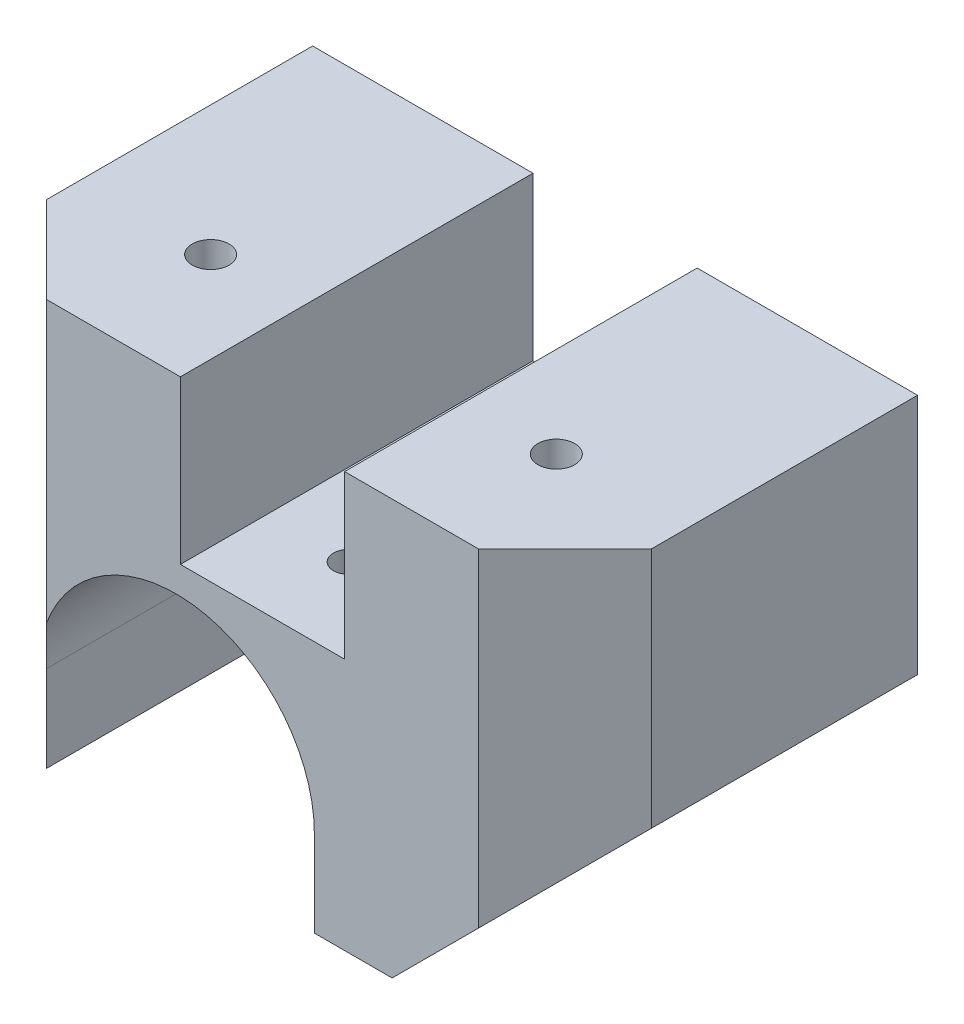
ISO-10303-21;
HEADER;
FILE_DESCRIPTION(('STEP AP214'),'2;1');
FILE_NAME('part.step','',(''),(''),'','','');
FILE_SCHEMA(('AUTOMOTIVE_DESIGN { 1 0 10303 214 1 1 1 1 }'));
ENDSEC;
DATA;
#1=APPLICATION_CONTEXT('core data for automotive mechanical design processes');
#2=APPLICATION_PROTOCOL_DEFINITION('international standard','automotive_design',2000,#1);
#3=PRODUCT_CONTEXT('',#1,'mechanical');
#4=PRODUCT('Part','Part','',(#3));
#5=PRODUCT_RELATED_PRODUCT_CATEGORY('part','',(#4));
#6=PRODUCT_DEFINITION_FORMATION('','',#4);
#7=PRODUCT_DEFINITION_CONTEXT('part definition',#1,'design');
#8=PRODUCT_DEFINITION('design','',#6,#7);
#9=PRODUCT_DEFINITION_SHAPE('','',#8);
#10=(LENGTH_UNIT() NAMED_UNIT(*) SI_UNIT(.MILLI.,.METRE.));
#11=(NAMED_UNIT(*) PLANE_ANGLE_UNIT() SI_UNIT($,.RADIAN.));
#12=(NAMED_UNIT(*) SI_UNIT($,.STERADIAN.) SOLID_ANGLE_UNIT());
#13=UNCERTAINTY_MEASURE_WITH_UNIT(LENGTH_MEASURE(1.E-05),#10,'distance_accuracy_value','');
#14=(GEOMETRIC_REPRESENTATION_CONTEXT(3) GLOBAL_UNCERTAINTY_ASSIGNED_CONTEXT((#13)) GLOBAL_UNIT_ASSIGNED_CONTEXT((#10,
#11,#12)) REPRESENTATION_CONTEXT('',''));
#15=CARTESIAN_POINT('',(0.,0.,0.));
#16=DIRECTION('',(0.,0.,1.));
#17=DIRECTION('',(1.,0.,0.));
#18=AXIS2_PLACEMENT_3D('',#15,#16,#17);
#19=CARTESIAN_POINT('',(0.,0.,0.));
#20=DIRECTION('',(0.,-1.,0.));
#21=DIRECTION('',(0.,0.,-1.));
#22=AXIS2_PLACEMENT_3D('',#19,#20,#21);
#23=PLANE('',#22);
#24=DIRECTION('',(0.,0.,-1.));
#25=VECTOR('',#24,1.);
#26=CARTESIAN_POINT('',(-16.51,0.,12.954));
#27=LINE('',#26,#25);
#28=CARTESIAN_POINT('',(-16.51,0.,12.319));
#29=VERTEX_POINT('',#28);
#30=CARTESIAN_POINT('',(-16.51,0.,-12.954));
#31=VERTEX_POINT('',#30);
#32=EDGE_CURVE('E196',#29,#31,#27,.T.);
#33=ORIENTED_EDGE('',*,*,#32,.F.);
#34=DIRECTION('',(0.707106781186547,0.,0.707106781186549));
#35=VECTOR('',#34,1.);
#36=CARTESIAN_POINT('',(-14.4145,0.,14.4145));
#37=LINE('',#36,#35);
#38=CARTESIAN_POINT('',(-22.225,0.,6.60399999999998));
#39=VERTEX_POINT('',#38);
#40=EDGE_CURVE('E281',#29,#39,#37,.F.);
#41=ORIENTED_EDGE('',*,*,#40,.T.);
#42=DIRECTION('',(0.,0.,1.));
#43=VECTOR('',#42,1.);
#44=CARTESIAN_POINT('',(-22.225,0.,12.954));
#45=LINE('',#44,#43);
#46=CARTESIAN_POINT('',(-22.225,0.,-12.954));
#47=VERTEX_POINT('',#46);
#48=EDGE_CURVE('E256',#47,#39,#45,.T.);
#49=ORIENTED_EDGE('',*,*,#48,.F.);
#50=DIRECTION('',(-1.,0.,0.));
#51=VECTOR('',#50,1.);
#52=CARTESIAN_POINT('',(-22.225,0.,-12.954));
#53=LINE('',#52,#51);
#54=EDGE_CURVE('E231',#31,#47,#53,.T.);
#55=ORIENTED_EDGE('',*,*,#54,.F.);
#56=EDGE_LOOP('',(#33,#41,#49,#55));
#57=FACE_BOUND('',#56,.T.);
#58=ADVANCED_FACE('F37',(#57),#23,.T.);
#59=CARTESIAN_POINT('',(0.,30.48,0.));
#60=DIRECTION('',(0.,-1.,0.));
#61=DIRECTION('',(0.,0.,-1.));
#62=AXIS2_PLACEMENT_3D('',#59,#60,#61);
#63=PLANE('',#62);
#64=CARTESIAN_POINT('',(12.7,30.48,4.064));
#65=DIRECTION('',(0.,1.,0.));
#66=DIRECTION('',(0.,0.,1.));
#67=AXIS2_PLACEMENT_3D('',#64,#65,#66);
#68=CIRCLE('',#67,1.35254999999999);
#69=CARTESIAN_POINT('',(12.7,30.48,5.41654999999999));
#70=VERTEX_POINT('',#69);
#71=EDGE_CURVE('E195',#70,#70,#68,.T.);
#72=ORIENTED_EDGE('',*,*,#71,.F.);
#73=EDGE_LOOP('',(#72));
#74=FACE_BOUND('',#73,.T.);
#75=DIRECTION('',(-1.,0.,0.));
#76=VECTOR('',#75,1.);
#77=CARTESIAN_POINT('',(-22.225,30.48,-12.954));
#78=LINE('',#77,#76);
#79=CARTESIAN_POINT('',(22.225,30.48,-12.954));
#80=VERTEX_POINT('',#79);
#81=CARTESIAN_POINT('',(6.0325,30.48,-12.954));
#82=VERTEX_POINT('',#81);
#83=EDGE_CURVE('E242',#80,#82,#78,.T.);
#84=ORIENTED_EDGE('',*,*,#83,.T.);
#85=DIRECTION('',(0.,0.,1.));
#86=VECTOR('',#85,1.);
#87=CARTESIAN_POINT('',(6.0325,30.48,-12.954));
#88=LINE('',#87,#86);
#89=CARTESIAN_POINT('',(6.0325,30.48,12.954));
#90=VERTEX_POINT('',#89);
#91=EDGE_CURVE('E222',#82,#90,#88,.T.);
#92=ORIENTED_EDGE('',*,*,#91,.T.);
#93=DIRECTION('',(1.,0.,0.));
#94=VECTOR('',#93,1.);
#95=CARTESIAN_POINT('',(-22.225,30.48,12.954));
#96=LINE('',#95,#94);
#97=CARTESIAN_POINT('',(15.875,30.48,12.954));
#98=VERTEX_POINT('',#97);
#99=EDGE_CURVE('E248',#90,#98,#96,.T.);
#100=ORIENTED_EDGE('',*,*,#99,.T.);
#101=DIRECTION('',(-0.70710678118655,0.,0.707106781186545));
#102=VECTOR('',#101,1.);
#103=CARTESIAN_POINT('',(22.225,30.48,6.60400000000001));
#104=LINE('',#103,#102);
#105=CARTESIAN_POINT('',(22.225,30.48,6.60400000000001));
#106=VERTEX_POINT('',#105);
#107=EDGE_CURVE('E285',#98,#106,#104,.F.);
#108=ORIENTED_EDGE('',*,*,#107,.T.);
#109=DIRECTION('',(0.,0.,-1.));
#110=VECTOR('',#109,1.);
#111=CARTESIAN_POINT('',(22.225,30.48,12.954));
#112=LINE('',#111,#110);
#113=EDGE_CURVE('E238',#106,#80,#112,.T.);
#114=ORIENTED_EDGE('',*,*,#113,.T.);
#115=EDGE_LOOP('',(#84,#92,#100,#108,#114));
#116=FACE_BOUND('',#115,.T.);
#117=ADVANCED_FACE('F337',(#74,#116),#63,.F.);
#118=CARTESIAN_POINT('',(22.225,30.48,12.954));
#119=DIRECTION('',(-1.,0.,0.));
#120=DIRECTION('',(0.,0.,1.));
#121=AXIS2_PLACEMENT_3D('',#118,#119,#120);
#122=PLANE('',#121);
#123=ORIENTED_EDGE('',*,*,#113,.F.);
#124=DIRECTION('',(0.,-1.,0.));
#125=VECTOR('',#124,1.);
#126=CARTESIAN_POINT('',(22.225,30.48,6.60400000000001));
#127=LINE('',#126,#125);
#128=CARTESIAN_POINT('',(22.225,12.7,6.60400000000001));
#129=VERTEX_POINT('',#128);
#130=EDGE_CURVE('E289',#106,#129,#127,.T.);
#131=ORIENTED_EDGE('',*,*,#130,.T.);
#132=DIRECTION('',(0.,0.,-1.));
#133=VECTOR('',#132,1.);
#134=CARTESIAN_POINT('',(22.225,12.7,-12.954));
#135=LINE('',#134,#133);
#136=CARTESIAN_POINT('',(22.225,12.7,-12.954));
#137=VERTEX_POINT('',#136);
#138=EDGE_CURVE('E265',#129,#137,#135,.T.);
#139=ORIENTED_EDGE('',*,*,#138,.T.);
#140=DIRECTION('',(0.,-1.,0.));
#141=VECTOR('',#140,1.);
#142=CARTESIAN_POINT('',(22.225,30.48,-12.954));
#143=LINE('',#142,#141);
#144=EDGE_CURVE('E262',#80,#137,#143,.T.);
#145=ORIENTED_EDGE('',*,*,#144,.F.);
#146=EDGE_LOOP('',(#123,#131,#139,#145));
#147=FACE_BOUND('',#146,.T.);
#148=ADVANCED_FACE('F343',(#147),#122,.F.);
#149=CARTESIAN_POINT('',(-22.225,30.48,-12.954));
#150=DIRECTION('',(0.,0.,1.));
#151=DIRECTION('',(1.,0.,0.));
#152=AXIS2_PLACEMENT_3D('',#149,#150,#151);
#153=PLANE('',#152);
#154=CARTESIAN_POINT('',(-18.8468,6.35,-12.954));
#155=DIRECTION('',(0.,0.,-1.));
#156=DIRECTION('',(-1.,0.,0.));
#157=AXIS2_PLACEMENT_3D('',#154,#155,#156);
#158=CIRCLE('',#157,1.13029999999999);
#159=CARTESIAN_POINT('',(-19.9771,6.35,-12.954));
#160=VERTEX_POINT('',#159);
#161=EDGE_CURVE('E169',#160,#160,#158,.T.);
#162=ORIENTED_EDGE('',*,*,#161,.F.);
#163=EDGE_LOOP('',(#162));
#164=FACE_BOUND('',#163,.T.);
#165=CARTESIAN_POINT('',(6.1468,6.35,-12.954));
#166=DIRECTION('',(0.,0.,-1.));
#167=DIRECTION('',(-1.,0.,0.));
#168=AXIS2_PLACEMENT_3D('',#165,#166,#167);
#169=CIRCLE('',#168,1.13029999999999);
#170=CARTESIAN_POINT('',(5.01650000000002,6.35,-12.954));
#171=VERTEX_POINT('',#170);
#172=EDGE_CURVE('E168',#171,#171,#169,.T.);
#173=ORIENTED_EDGE('',*,*,#172,.F.);
#174=EDGE_LOOP('',(#173));
#175=FACE_BOUND('',#174,.T.);
#176=CARTESIAN_POINT('',(-6.34999999999999,6.35,-12.954));
#177=DIRECTION('',(0.,0.,-1.));
#178=DIRECTION('',(-1.,0.,0.));
#179=AXIS2_PLACEMENT_3D('',#176,#177,#178);
#180=CIRCLE('',#179,10.16);
#181=CARTESIAN_POINT('',(-16.51,6.35,-12.954));
#182=VERTEX_POINT('',#181);
#183=CARTESIAN_POINT('',(3.81000000000001,6.35,-12.954));
#184=VERTEX_POINT('',#183);
#185=EDGE_CURVE('E180',#182,#184,#180,.T.);
#186=ORIENTED_EDGE('',*,*,#185,.F.);
#187=DIRECTION('',(0.,1.,0.));
#188=VECTOR('',#187,1.);
#189=CARTESIAN_POINT('',(-16.51,6.35,-12.954));
#190=LINE('',#189,#188);
#191=EDGE_CURVE('E185',#31,#182,#190,.T.);
#192=ORIENTED_EDGE('',*,*,#191,.F.);
#193=ORIENTED_EDGE('',*,*,#54,.T.);
#194=DIRECTION('',(0.,-1.,0.));
#195=VECTOR('',#194,1.);
#196=CARTESIAN_POINT('',(-22.225,30.48,-12.954));
#197=LINE('',#196,#195);
#198=CARTESIAN_POINT('',(-22.225,30.48,-12.954));
#199=VERTEX_POINT('',#198);
#200=EDGE_CURVE('E252',#199,#47,#197,.T.);
#201=ORIENTED_EDGE('',*,*,#200,.F.);
#202=CARTESIAN_POINT('',(-6.0325,30.48,-12.954));
#203=VERTEX_POINT('',#202);
#204=EDGE_CURVE('E240',#203,#199,#78,.T.);
#205=ORIENTED_EDGE('',*,*,#204,.F.);
#206=DIRECTION('',(0.,-1.,0.));
#207=VECTOR('',#206,1.);
#208=CARTESIAN_POINT('',(-6.0325,30.48,-12.954));
#209=LINE('',#208,#207);
#210=CARTESIAN_POINT('',(-6.0325,18.542,-12.954));
#211=VERTEX_POINT('',#210);
#212=EDGE_CURVE('E64',#203,#211,#209,.T.);
#213=ORIENTED_EDGE('',*,*,#212,.T.);
#214=DIRECTION('',(1.,0.,0.));
#215=VECTOR('',#214,1.);
#216=CARTESIAN_POINT('',(-6.0325,18.542,-12.954));
#217=LINE('',#216,#215);
#218=CARTESIAN_POINT('',(6.0325,18.542,-12.954));
#219=VERTEX_POINT('',#218);
#220=EDGE_CURVE('E219',#211,#219,#217,.T.);
#221=ORIENTED_EDGE('',*,*,#220,.T.);
#222=DIRECTION('',(0.,1.,0.));
#223=VECTOR('',#222,1.);
#224=CARTESIAN_POINT('',(6.0325,30.48,-12.954));
#225=LINE('',#224,#223);
#226=EDGE_CURVE('E214',#219,#82,#225,.T.);
#227=ORIENTED_EDGE('',*,*,#226,.T.);
#228=ORIENTED_EDGE('',*,*,#83,.F.);
#229=ORIENTED_EDGE('',*,*,#144,.T.);
#230=DIRECTION('',(-0.707106781186548,-0.707106781186546,0.));
#231=VECTOR('',#230,1.);
#232=CARTESIAN_POINT('',(22.225,12.7,-12.954));
#233=LINE('',#232,#231);
#234=CARTESIAN_POINT('',(9.52499999999996,0.,-12.954));
#235=VERTEX_POINT('',#234);
#236=EDGE_CURVE('E267',#137,#235,#233,.T.);
#237=ORIENTED_EDGE('',*,*,#236,.T.);
#238=CARTESIAN_POINT('',(3.81000000000001,0.,-12.954));
#239=VERTEX_POINT('',#238);
#240=EDGE_CURVE('E253',#235,#239,#53,.T.);
#241=ORIENTED_EDGE('',*,*,#240,.T.);
#242=DIRECTION('',(0.,-1.,0.));
#243=VECTOR('',#242,1.);
#244=CARTESIAN_POINT('',(3.81000000000001,0.,-12.954));
#245=LINE('',#244,#243);
#246=EDGE_CURVE('E191',#184,#239,#245,.T.);
#247=ORIENTED_EDGE('',*,*,#246,.F.);
#248=EDGE_LOOP('',(#186,#192,#193,#201,#205,#213,#221,#227,#228,#229,#237,#241,#247));
#249=FACE_BOUND('',#248,.T.);
#250=ADVANCED_FACE('F318',(#164,#175,#249),#153,.F.);
#251=CARTESIAN_POINT('',(-22.225,30.48,12.954));
#252=DIRECTION('',(1.,0.,0.));
#253=DIRECTION('',(0.,0.,-1.));
#254=AXIS2_PLACEMENT_3D('',#251,#252,#253);
#255=PLANE('',#254);
#256=ORIENTED_EDGE('',*,*,#48,.T.);
#257=DIRECTION('',(0.,1.,0.));
#258=VECTOR('',#257,1.);
#259=CARTESIAN_POINT('',(-22.225,30.48,6.60399999999998));
#260=LINE('',#259,#258);
#261=CARTESIAN_POINT('',(-22.225,30.48,6.60399999999998));
#262=VERTEX_POINT('',#261);
#263=EDGE_CURVE('E283',#39,#262,#260,.T.);
#264=ORIENTED_EDGE('',*,*,#263,.T.);
#265=DIRECTION('',(0.,0.,1.));
#266=VECTOR('',#265,1.);
#267=CARTESIAN_POINT('',(-22.225,30.48,12.954));
#268=LINE('',#267,#266);
#269=EDGE_CURVE('E245',#199,#262,#268,.T.);
#270=ORIENTED_EDGE('',*,*,#269,.F.);
#271=ORIENTED_EDGE('',*,*,#200,.T.);
#272=EDGE_LOOP('',(#256,#264,#270,#271));
#273=FACE_BOUND('',#272,.T.);
#274=ADVANCED_FACE('F310',(#273),#255,.F.);
#275=CARTESIAN_POINT('',(-22.225,30.48,12.954));
#276=DIRECTION('',(0.,0.,-1.));
#277=DIRECTION('',(-1.,0.,0.));
#278=AXIS2_PLACEMENT_3D('',#275,#276,#277);
#279=PLANE('',#278);
#280=DIRECTION('',(0.,-1.,0.));
#281=VECTOR('',#280,1.);
#282=CARTESIAN_POINT('',(-15.875,30.48,12.954));
#283=LINE('',#282,#281);
#284=CARTESIAN_POINT('',(-15.875,30.48,12.954));
#285=VERTEX_POINT('',#284);
#286=CARTESIAN_POINT('',(-15.875,9.88553037039707,12.954));
#287=VERTEX_POINT('',#286);
#288=EDGE_CURVE('E278',#285,#287,#283,.T.);
#289=ORIENTED_EDGE('',*,*,#288,.T.);
#290=CARTESIAN_POINT('',(-6.34999999999999,6.35,12.954));
#291=DIRECTION('',(0.,0.,-1.));
#292=DIRECTION('',(-1.,0.,0.));
#293=AXIS2_PLACEMENT_3D('',#290,#291,#292);
#294=CIRCLE('',#293,10.16);
#295=CARTESIAN_POINT('',(3.81000000000001,6.35,12.954));
#296=VERTEX_POINT('',#295);
#297=EDGE_CURVE('E181',#287,#296,#294,.T.);
#298=ORIENTED_EDGE('',*,*,#297,.T.);
#299=DIRECTION('',(0.,-1.,0.));
#300=VECTOR('',#299,1.);
#301=CARTESIAN_POINT('',(3.81000000000001,0.,12.954));
#302=LINE('',#301,#300);
#303=CARTESIAN_POINT('',(3.81000000000001,0.,12.954));
#304=VERTEX_POINT('',#303);
#305=EDGE_CURVE('E184',#296,#304,#302,.T.);
#306=ORIENTED_EDGE('',*,*,#305,.T.);
#307=DIRECTION('',(1.,0.,0.));
#308=VECTOR('',#307,1.);
#309=CARTESIAN_POINT('',(-22.225,0.,12.954));
#310=LINE('',#309,#308);
#311=CARTESIAN_POINT('',(9.52499999999997,0.,12.954));
#312=VERTEX_POINT('',#311);
#313=EDGE_CURVE('E241',#304,#312,#310,.T.);
#314=ORIENTED_EDGE('',*,*,#313,.T.);
#315=DIRECTION('',(0.707106781186548,0.707106781186546,0.));
#316=VECTOR('',#315,1.);
#317=CARTESIAN_POINT('',(22.225,12.7,12.954));
#318=LINE('',#317,#316);
#319=CARTESIAN_POINT('',(15.875,6.34999999999999,12.954));
#320=VERTEX_POINT('',#319);
#321=EDGE_CURVE('E272',#312,#320,#318,.T.);
#322=ORIENTED_EDGE('',*,*,#321,.T.);
#323=DIRECTION('',(0.,1.,0.));
#324=VECTOR('',#323,1.);
#325=CARTESIAN_POINT('',(15.875,30.48,12.954));
#326=LINE('',#325,#324);
#327=EDGE_CURVE('E275',#320,#98,#326,.T.);
#328=ORIENTED_EDGE('',*,*,#327,.T.);
#329=ORIENTED_EDGE('',*,*,#99,.F.);
#330=DIRECTION('',(0.,1.,0.));
#331=VECTOR('',#330,1.);
#332=CARTESIAN_POINT('',(6.0325,30.48,12.954));
#333=LINE('',#332,#331);
#334=CARTESIAN_POINT('',(6.0325,18.542,12.954));
#335=VERTEX_POINT('',#334);
#336=EDGE_CURVE('E213',#335,#90,#333,.T.);
#337=ORIENTED_EDGE('',*,*,#336,.F.);
#338=DIRECTION('',(1.,0.,0.));
#339=VECTOR('',#338,1.);
#340=CARTESIAN_POINT('',(-6.0325,18.542,12.954));
#341=LINE('',#340,#339);
#342=CARTESIAN_POINT('',(-6.0325,18.542,12.954));
#343=VERTEX_POINT('',#342);
#344=EDGE_CURVE('E217',#343,#335,#341,.T.);
#345=ORIENTED_EDGE('',*,*,#344,.F.);
#346=DIRECTION('',(0.,-1.,0.));
#347=VECTOR('',#346,1.);
#348=CARTESIAN_POINT('',(-6.0325,30.48,12.954));
#349=LINE('',#348,#347);
#350=CARTESIAN_POINT('',(-6.0325,30.48,12.954));
#351=VERTEX_POINT('',#350);
#352=EDGE_CURVE('E224',#351,#343,#349,.T.);
#353=ORIENTED_EDGE('',*,*,#352,.F.);
#354=EDGE_CURVE('E249',#285,#351,#96,.T.);
#355=ORIENTED_EDGE('',*,*,#354,.F.);
#356=EDGE_LOOP('',(#289,#298,#306,#314,#322,#328,#329,#337,#345,#353,#355));
#357=FACE_BOUND('',#356,.T.);
#358=ADVANCED_FACE('F324',(#357),#279,.F.);
#359=CARTESIAN_POINT('',(-12.7,30.48,4.064));
#360=DIRECTION('',(0.,1.,0.));
#361=DIRECTION('',(0.,0.,1.));
#362=AXIS2_PLACEMENT_3D('',#359,#360,#361);
#363=CIRCLE('',#362,1.35254999999999);
#364=CARTESIAN_POINT('',(-12.7,30.48,5.41654999999999));
#365=VERTEX_POINT('',#364);
#366=EDGE_CURVE('E207',#365,#365,#363,.T.);
#367=ORIENTED_EDGE('',*,*,#366,.F.);
#368=EDGE_LOOP('',(#367));
#369=FACE_BOUND('',#368,.T.);
#370=ORIENTED_EDGE('',*,*,#354,.T.);
#371=DIRECTION('',(0.,0.,1.));
#372=VECTOR('',#371,1.);
#373=CARTESIAN_POINT('',(-6.0325,30.48,-12.954));
#374=LINE('',#373,#372);
#375=EDGE_CURVE('E234',#203,#351,#374,.T.);
#376=ORIENTED_EDGE('',*,*,#375,.F.);
#377=ORIENTED_EDGE('',*,*,#204,.T.);
#378=ORIENTED_EDGE('',*,*,#269,.T.);
#379=DIRECTION('',(-0.707106781186547,0.,-0.707106781186549));
#380=VECTOR('',#379,1.);
#381=CARTESIAN_POINT('',(-15.875,30.48,12.954));
#382=LINE('',#381,#380);
#383=EDGE_CURVE('E287',#262,#285,#382,.F.);
#384=ORIENTED_EDGE('',*,*,#383,.T.);
#385=EDGE_LOOP('',(#370,#376,#377,#378,#384));
#386=FACE_BOUND('',#385,.T.);
#387=ADVANCED_FACE('F312',(#369,#386),#63,.F.);
#388=DIRECTION('',(0.,0.,-1.));
#389=VECTOR('',#388,1.);
#390=CARTESIAN_POINT('',(3.81000000000001,0.,12.954));
#391=LINE('',#390,#389);
#392=EDGE_CURVE('E198',#304,#239,#391,.T.);
#393=ORIENTED_EDGE('',*,*,#392,.T.);
#394=ORIENTED_EDGE('',*,*,#240,.F.);
#395=DIRECTION('',(0.,0.,1.));
#396=VECTOR('',#395,1.);
#397=CARTESIAN_POINT('',(9.52499999999996,0.,12.954));
#398=LINE('',#397,#396);
#399=EDGE_CURVE('E269',#235,#312,#398,.T.);
#400=ORIENTED_EDGE('',*,*,#399,.T.);
#401=ORIENTED_EDGE('',*,*,#313,.F.);
#402=EDGE_LOOP('',(#393,#394,#400,#401));
#403=FACE_BOUND('',#402,.T.);
#404=ADVANCED_FACE('F355',(#403),#23,.T.);
#405=CARTESIAN_POINT('',(22.225,12.7,12.954));
#406=DIRECTION('',(0.707106781186546,-0.707106781186548,0.));
#407=DIRECTION('',(0.,0.,1.));
#408=AXIS2_PLACEMENT_3D('',#405,#406,#407);
#409=PLANE('',#408);
#410=ORIENTED_EDGE('',*,*,#138,.F.);
#411=DIRECTION('',(0.577350269189627,0.577350269189626,-0.577350269189624));
#412=VECTOR('',#411,1.);
#413=CARTESIAN_POINT('',(20.1083333333333,10.5833333333333,8.72066666666666));
#414=LINE('',#413,#412);
#415=EDGE_CURVE('E292',#129,#320,#414,.F.);
#416=ORIENTED_EDGE('',*,*,#415,.T.);
#417=ORIENTED_EDGE('',*,*,#321,.F.);
#418=ORIENTED_EDGE('',*,*,#399,.F.);
#419=ORIENTED_EDGE('',*,*,#236,.F.);
#420=EDGE_LOOP('',(#410,#416,#417,#418,#419));
#421=FACE_BOUND('',#420,.T.);
#422=ADVANCED_FACE('F349',(#421),#409,.T.);
#423=CARTESIAN_POINT('',(-15.875,30.48,12.954));
#424=DIRECTION('',(0.707106781186548,0.,-0.707106781186546));
#425=DIRECTION('',(0.,-1.,0.));
#426=AXIS2_PLACEMENT_3D('',#423,#424,#425);
#427=PLANE('',#426);
#428=CARTESIAN_POINT('',(-6.34999999999999,6.35,22.479));
#429=DIRECTION('',(0.707106781186548,0.,-0.707106781186546));
#430=DIRECTION('',(-0.707106781186547,0.,-0.707106781186549));
#431=AXIS2_PLACEMENT_3D('',#428,#429,#430);
#432=ELLIPSE('',#431,14.3684097937107,10.16);
#433=CARTESIAN_POINT('',(-16.51,6.35,12.319));
#434=VERTEX_POINT('',#433);
#435=EDGE_CURVE('E11',#287,#434,#432,.F.);
#436=ORIENTED_EDGE('',*,*,#435,.F.);
#437=ORIENTED_EDGE('',*,*,#288,.F.);
#438=ORIENTED_EDGE('',*,*,#383,.F.);
#439=ORIENTED_EDGE('',*,*,#263,.F.);
#440=ORIENTED_EDGE('',*,*,#40,.F.);
#441=DIRECTION('',(0.,1.,0.));
#442=VECTOR('',#441,1.);
#443=CARTESIAN_POINT('',(-16.51,30.48,12.319));
#444=LINE('',#443,#442);
#445=EDGE_CURVE('E50',#434,#29,#444,.F.);
#446=ORIENTED_EDGE('',*,*,#445,.F.);
#447=EDGE_LOOP('',(#436,#437,#438,#439,#440,#446));
#448=FACE_BOUND('',#447,.T.);
#449=ADVANCED_FACE('F305',(#448),#427,.F.);
#450=CARTESIAN_POINT('',(22.225,30.48,6.60400000000001));
#451=DIRECTION('',(-0.707106781186545,0.,-0.707106781186549));
#452=DIRECTION('',(0.,-1.,0.));
#453=AXIS2_PLACEMENT_3D('',#450,#451,#452);
#454=PLANE('',#453);
#455=ORIENTED_EDGE('',*,*,#107,.F.);
#456=ORIENTED_EDGE('',*,*,#327,.F.);
#457=ORIENTED_EDGE('',*,*,#415,.F.);
#458=ORIENTED_EDGE('',*,*,#130,.F.);
#459=EDGE_LOOP('',(#455,#456,#457,#458));
#460=FACE_BOUND('',#459,.T.);
#461=ADVANCED_FACE('F39',(#460),#454,.F.);
#462=CARTESIAN_POINT('',(6.0325,30.48,-12.954));
#463=DIRECTION('',(1.,0.,0.));
#464=DIRECTION('',(0.,1.,0.));
#465=AXIS2_PLACEMENT_3D('',#462,#463,#464);
#466=PLANE('',#465);
#467=ORIENTED_EDGE('',*,*,#336,.T.);
#468=ORIENTED_EDGE('',*,*,#91,.F.);
#469=ORIENTED_EDGE('',*,*,#226,.F.);
#470=DIRECTION('',(0.,0.,1.));
#471=VECTOR('',#470,1.);
#472=CARTESIAN_POINT('',(6.0325,18.542,-12.954));
#473=LINE('',#472,#471);
#474=EDGE_CURVE('E229',#219,#335,#473,.T.);
#475=ORIENTED_EDGE('',*,*,#474,.T.);
#476=EDGE_LOOP('',(#467,#468,#469,#475));
#477=FACE_BOUND('',#476,.T.);
#478=ADVANCED_FACE('F388',(#477),#466,.F.);
#479=CARTESIAN_POINT('',(-6.0325,18.542,-12.954));
#480=DIRECTION('',(0.,-1.,0.));
#481=DIRECTION('',(0.,0.,-1.));
#482=AXIS2_PLACEMENT_3D('',#479,#480,#481);
#483=PLANE('',#482);
#484=CARTESIAN_POINT('',(0.,18.542,6.604));
#485=DIRECTION('',(0.,1.,0.));
#486=DIRECTION('',(0.,0.,1.));
#487=AXIS2_PLACEMENT_3D('',#484,#485,#486);
#488=CIRCLE('',#487,1.13029999999999);
#489=CARTESIAN_POINT('',(0.,18.542,7.73429999999999));
#490=VERTEX_POINT('',#489);
#491=EDGE_CURVE('E420',#490,#490,#488,.T.);
#492=ORIENTED_EDGE('',*,*,#491,.F.);
#493=EDGE_LOOP('',(#492));
#494=FACE_BOUND('',#493,.T.);
#495=ORIENTED_EDGE('',*,*,#344,.T.);
#496=ORIENTED_EDGE('',*,*,#474,.F.);
#497=ORIENTED_EDGE('',*,*,#220,.F.);
#498=DIRECTION('',(0.,0.,1.));
#499=VECTOR('',#498,1.);
#500=CARTESIAN_POINT('',(-6.0325,18.542,-12.954));
#501=LINE('',#500,#499);
#502=EDGE_CURVE('E232',#211,#343,#501,.T.);
#503=ORIENTED_EDGE('',*,*,#502,.T.);
#504=EDGE_LOOP('',(#495,#496,#497,#503));
#505=FACE_BOUND('',#504,.T.);
#506=ADVANCED_FACE('F331',(#494,#505),#483,.F.);
#507=CARTESIAN_POINT('',(-6.0325,30.48,-12.954));
#508=DIRECTION('',(-1.,0.,0.));
#509=DIRECTION('',(0.,-1.,0.));
#510=AXIS2_PLACEMENT_3D('',#507,#508,#509);
#511=PLANE('',#510);
#512=ORIENTED_EDGE('',*,*,#352,.T.);
#513=ORIENTED_EDGE('',*,*,#502,.F.);
#514=ORIENTED_EDGE('',*,*,#212,.F.);
#515=ORIENTED_EDGE('',*,*,#375,.T.);
#516=EDGE_LOOP('',(#512,#513,#514,#515));
#517=FACE_BOUND('',#516,.T.);
#518=ADVANCED_FACE('F328',(#517),#511,.F.);
#519=CARTESIAN_POINT('',(-12.7,16.002,4.064));
#520=DIRECTION('',(0.,1.,0.));
#521=DIRECTION('',(0.,0.,1.));
#522=AXIS2_PLACEMENT_3D('',#519,#520,#521);
#523=CONICAL_SURFACE('',#522,1.35255,1.02974425867665);
#524=CARTESIAN_POINT('',(-12.7,15.1893059697343,4.064));
#525=VERTEX_POINT('',#524);
#526=VERTEX_LOOP('',#525);
#527=FACE_BOUND('',#526,.T.);
#528=CARTESIAN_POINT('',(-12.7,16.002,4.064));
#529=DIRECTION('',(0.,1.,0.));
#530=DIRECTION('',(0.,0.,1.));
#531=AXIS2_PLACEMENT_3D('',#528,#529,#530);
#532=CIRCLE('',#531,1.35255);
#533=CARTESIAN_POINT('',(-12.7,16.002,5.41655));
#534=VERTEX_POINT('',#533);
#535=EDGE_CURVE('E210',#534,#534,#532,.T.);
#536=ORIENTED_EDGE('',*,*,#535,.T.);
#537=EDGE_LOOP('',(#536));
#538=FACE_BOUND('',#537,.T.);
#539=ADVANCED_FACE('F393',(#527,#538),#523,.F.);
#540=CARTESIAN_POINT('',(-12.7,30.48,4.064));
#541=DIRECTION('',(0.,1.,0.));
#542=DIRECTION('',(0.,0.,1.));
#543=AXIS2_PLACEMENT_3D('',#540,#541,#542);
#544=CYLINDRICAL_SURFACE('',#543,1.35254999999999);
#545=ORIENTED_EDGE('',*,*,#535,.F.);
#546=EDGE_LOOP('',(#545));
#547=FACE_BOUND('',#546,.T.);
#548=ORIENTED_EDGE('',*,*,#366,.T.);
#549=EDGE_LOOP('',(#548));
#550=FACE_BOUND('',#549,.T.);
#551=ADVANCED_FACE('F399',(#547,#550),#544,.F.);
#552=CARTESIAN_POINT('',(12.7,16.002,4.064));
#553=DIRECTION('',(0.,1.,0.));
#554=DIRECTION('',(0.,0.,1.));
#555=AXIS2_PLACEMENT_3D('',#552,#553,#554);
#556=CONICAL_SURFACE('',#555,1.35255,1.02974425867665);
#557=CARTESIAN_POINT('',(12.7,15.1893059697343,4.064));
#558=VERTEX_POINT('',#557);
#559=VERTEX_LOOP('',#558);
#560=FACE_BOUND('',#559,.T.);
#561=CARTESIAN_POINT('',(12.7,16.002,4.064));
#562=DIRECTION('',(0.,1.,0.));
#563=DIRECTION('',(0.,0.,1.));
#564=AXIS2_PLACEMENT_3D('',#561,#562,#563);
#565=CIRCLE('',#564,1.35255);
#566=CARTESIAN_POINT('',(12.7,16.002,5.41655));
#567=VERTEX_POINT('',#566);
#568=EDGE_CURVE('E204',#567,#567,#565,.T.);
#569=ORIENTED_EDGE('',*,*,#568,.T.);
#570=EDGE_LOOP('',(#569));
#571=FACE_BOUND('',#570,.T.);
#572=ADVANCED_FACE('F403',(#560,#571),#556,.F.);
#573=CARTESIAN_POINT('',(12.7,30.48,4.064));
#574=DIRECTION('',(0.,1.,0.));
#575=DIRECTION('',(0.,0.,1.));
#576=AXIS2_PLACEMENT_3D('',#573,#574,#575);
#577=CYLINDRICAL_SURFACE('',#576,1.35254999999999);
#578=ORIENTED_EDGE('',*,*,#568,.F.);
#579=EDGE_LOOP('',(#578));
#580=FACE_BOUND('',#579,.T.);
#581=ORIENTED_EDGE('',*,*,#71,.T.);
#582=EDGE_LOOP('',(#581));
#583=FACE_BOUND('',#582,.T.);
#584=ADVANCED_FACE('F407',(#580,#583),#577,.F.);
#585=CARTESIAN_POINT('',(-6.34999999999999,6.35,12.954));
#586=DIRECTION('',(0.,0.,-1.));
#587=DIRECTION('',(-1.,0.,0.));
#588=AXIS2_PLACEMENT_3D('',#585,#586,#587);
#589=CYLINDRICAL_SURFACE('',#588,10.16);
#590=CARTESIAN_POINT('',(0.,14.281147457966,7.73429999999999));
#591=CARTESIAN_POINT('',(0.0744775665816655,14.2215153896568,7.73429974120147));
#592=CARTESIAN_POINT('',(0.148206619047337,14.1607489245614,7.72694087820839));
#593=CARTESIAN_POINT('',(0.29253430610175,14.0383906734652,7.69827808795098));
#594=CARTESIAN_POINT('',(0.363120288611187,13.9767966595383,7.67692243735597));
#595=CARTESIAN_POINT('',(0.507348815288195,13.8475173268659,7.61738250958503));
#596=CARTESIAN_POINT('',(0.580419586718664,13.7799398360348,7.5775546643557));
#597=CARTESIAN_POINT('',(0.718316707882784,13.6488680752979,7.48074165125724));
#598=CARTESIAN_POINT('',(0.783165430054997,13.5853629679477,7.42380452772157));
#599=CARTESIAN_POINT('',(0.877204118286901,13.4911211595004,7.31872946219244));
#600=CARTESIAN_POINT('',(0.910158706371163,13.4575743069297,7.27645577389174));
#601=CARTESIAN_POINT('',(0.970886708804835,13.3950054808619,7.18533070310138));
#602=CARTESIAN_POINT('',(0.998668672314869,13.3659760543763,7.13649040803177));
#603=CARTESIAN_POINT('',(1.04252128858025,13.3197226261851,7.04310425476584));
#604=CARTESIAN_POINT('',(1.05982540120619,13.3012985405518,6.99973977345536));
#605=CARTESIAN_POINT('',(1.08928067066668,13.2697666263523,6.90944170115646));
#606=CARTESIAN_POINT('',(1.10143571416526,13.2566547882775,6.86251083385115));
#607=CARTESIAN_POINT('',(1.119764267178,13.2368288628846,6.76570709236629));
#608=CARTESIAN_POINT('',(1.12588575431939,13.2301704259562,6.71581249766324));
#609=CARTESIAN_POINT('',(1.13136348341652,13.2242141562648,6.61522507876359));
#610=CARTESIAN_POINT('',(1.13072421317987,13.2249114407548,6.56453280638292));
#611=CARTESIAN_POINT('',(1.12329868484113,13.232980904759,6.47102642032021));
#612=CARTESIAN_POINT('',(1.11734161090406,13.2394526341395,6.42806149722257));
#613=CARTESIAN_POINT('',(1.10084323038913,13.257291947133,6.34408488997046));
#614=CARTESIAN_POINT('',(1.09029983241818,13.2686617642826,6.30307410639366));
#615=CARTESIAN_POINT('',(1.06120688039927,13.2998341931698,6.21101786840448));
#616=CARTESIAN_POINT('',(1.04117480602748,13.3211712083973,6.16096333144087));
#617=CARTESIAN_POINT('',(0.995575952089431,13.3692032364534,6.06624170726855));
#618=CARTESIAN_POINT('',(0.969998335506276,13.395908732741,6.02158543925204));
#619=CARTESIAN_POINT('',(0.903633943119572,13.4643127385485,5.92142429287951));
#620=CARTESIAN_POINT('',(0.860808779119727,13.5077931367756,5.86849495185188));
#621=CARTESIAN_POINT('',(0.768936422382271,13.5991774871079,5.77290268293198));
#622=CARTESIAN_POINT('',(0.719878715265163,13.6470888763036,5.7302574652658));
#623=CARTESIAN_POINT('',(0.601955814232415,13.7597453082965,5.64378197693013));
#624=CARTESIAN_POINT('',(0.531484096198936,13.8253277191277,5.60322672969472));
#625=CARTESIAN_POINT('',(0.384682129171814,13.9578555447443,5.53814514317418));
#626=CARTESIAN_POINT('',(0.308347861719735,14.0248018709041,5.51362991001277));
#627=CARTESIAN_POINT('',(0.151066179455083,14.1584866229195,5.48094482539785));
#628=CARTESIAN_POINT('',(0.0700892823284694,14.2252200060363,5.47289500151557));
#629=CARTESIAN_POINT('',(-0.0937893663047979,14.3560211460618,5.4746292290423));
#630=CARTESIAN_POINT('',(-0.176688714024088,14.4200919788352,5.4843920818282));
#631=CARTESIAN_POINT('',(-0.323799811708885,14.5302861700205,5.51903260126177));
#632=CARTESIAN_POINT('',(-0.388207121452341,14.5773120755646,5.5402204247826));
#633=CARTESIAN_POINT('',(-0.514426840351656,14.66731105791,5.59520525263889));
#634=CARTESIAN_POINT('',(-0.57624242146599,14.7102891741167,5.62898631163125));
#635=CARTESIAN_POINT('',(-0.6848679725413,14.7841843035765,5.70283295601769));
#636=CARTESIAN_POINT('',(-0.732464076339664,14.8159185905893,5.74091998535624));
#637=CARTESIAN_POINT('',(-0.822274343254927,14.8748301953103,5.82601304193685));
#638=CARTESIAN_POINT('',(-0.864489553320442,14.9020083998108,5.87301732972533));
#639=CARTESIAN_POINT('',(-0.941765948635699,14.9510884350672,5.97566166351803));
#640=CARTESIAN_POINT('',(-0.97677431024667,14.97295150509,6.03136055318349));
#641=CARTESIAN_POINT('',(-1.03712053495355,15.0102645342945,6.14973150016702));
#642=CARTESIAN_POINT('',(-1.06246604502601,15.0257195655145,6.21239799252677));
#643=CARTESIAN_POINT('',(-1.09919851404748,15.0479931761524,6.33409352161402));
#644=CARTESIAN_POINT('',(-1.11196220038131,15.0556673228343,6.39255258108355));
#645=CARTESIAN_POINT('',(-1.12807098154209,15.0653399438626,6.51120456968059));
#646=CARTESIAN_POINT('',(-1.13142155390099,15.0673417189925,6.57139646984943));
#647=CARTESIAN_POINT('',(-1.12863170388504,15.0656704365511,6.6865507205022));
#648=CARTESIAN_POINT('',(-1.12324156572358,15.0624459976483,6.74153996909071));
#649=CARTESIAN_POINT('',(-1.10464121505461,15.0512601259624,6.8496710372269));
#650=CARTESIAN_POINT('',(-1.09143189055838,15.0432992310899,6.90281306583463));
#651=CARTESIAN_POINT('',(-1.0578207740197,15.0228785479854,7.00591894637674));
#652=CARTESIAN_POINT('',(-1.03740953193363,15.0104128482215,7.05587852025784));
#653=CARTESIAN_POINT('',(-0.990318626523061,14.9813485930882,7.15143668354152));
#654=CARTESIAN_POINT('',(-0.963637467525794,14.9647490515447,7.19703422873568));
#655=CARTESIAN_POINT('',(-0.902943862949583,14.9265116809284,7.28619150581349));
#656=CARTESIAN_POINT('',(-0.868540497109699,14.9045960972275,7.32936471019012));
#657=CARTESIAN_POINT('',(-0.795085609958353,14.8570817598174,7.40921052108405));
#658=CARTESIAN_POINT('',(-0.756032590449134,14.8314818183875,7.44588102279322));
#659=CARTESIAN_POINT('',(-0.66920486232294,14.7736111618665,7.51684334703746));
#660=CARTESIAN_POINT('',(-0.620957146032857,14.7409058849717,7.55019951356686));
#661=CARTESIAN_POINT('',(-0.521677257060467,14.6722536150522,7.6083642487559));
#662=CARTESIAN_POINT('',(-0.470642401741119,14.6363034763114,7.63316440807192));
#663=CARTESIAN_POINT('',(-0.358092812056798,14.5553790831485,7.67807234565601));
#664=CARTESIAN_POINT('',(-0.296301104875334,14.5099237274209,7.69661024992396));
#665=CARTESIAN_POINT('',(-0.172425448417854,14.4165469266083,7.72286160957641));
#666=CARTESIAN_POINT('',(-0.110341955776568,14.3686286049867,7.73058844046835));
#667=CARTESIAN_POINT('',(-0.0324714359647026,14.3070642038877,7.73395118331867));
#668=CARTESIAN_POINT('',(-0.0162179715070647,14.2941327262707,7.73430005635504));
#669=CARTESIAN_POINT('',(0.,14.281147457966,7.73429999999999));
#670=B_SPLINE_CURVE_WITH_KNOTS('',3,(#590,#591,#592,#593,#594,#595,#596,#597,#598,#599,#600,
#601,#602,#603,#604,#605,#606,#607,#608,#609,#610,#611,#612,#613,#614,#615,#616,#617,#618,#619,
#620,#621,#622,#623,#624,#625,#626,#627,#628,#629,#630,#631,#632,#633,#634,#635,#636,#637,#638,
#639,#640,#641,#642,#643,#644,#645,#646,#647,#648,#649,#650,#651,#652,#653,#654,#655,#656,#657,
#658,#659,#660,#661,#662,#663,#664,#665,#666,#667,#668,#669),.UNSPECIFIED.,.T.,.F.,(4,2,2,2,2,2,
2,2,2,2,2,2,2,2,2,2,2,2,2,2,2,2,2,2,2,2,2,2,2,2,2,2,2,2,2,2,2,2,2,4),(0.,0.286186556848356,
0.57343668776838,0.893496831357586,1.21266648634921,1.40181563741685,1.59064933805773,
1.74066161174488,1.89056044925151,2.04174072063681,2.19282064448317,2.32379912438889,
2.45483739403416,2.62782817241422,2.8011601037869,3.042194556968,3.2836411765019,
3.59543690992708,3.90744830324349,4.2217261689013,4.53563026069751,4.78222592408309,
5.0285104068718,5.23384901543853,5.43914761054099,5.64590123045855,5.85249088860152,
6.03249031727698,6.21238498178565,6.37763786960985,6.54287199355313,6.70832374180971,
6.87381499829775,7.05128740870576,7.22881715930689,7.42952539387514,7.63043033795008,
7.86633118306657,8.10193991176907,8.16425888428252),.UNSPECIFIED.);
#671=CARTESIAN_POINT('',(0.,14.281147457966,7.73429999999999));
#672=VERTEX_POINT('',#671);
#673=EDGE_CURVE('E41',#672,#672,#670,.T.);
#674=ORIENTED_EDGE('',*,*,#673,.T.);
#675=EDGE_LOOP('',(#674));
#676=FACE_BOUND('',#675,.T.);
#677=ORIENTED_EDGE('',*,*,#435,.T.);
#678=DIRECTION('',(0.,0.,-1.));
#679=VECTOR('',#678,1.);
#680=CARTESIAN_POINT('',(-16.51,6.35,12.954));
#681=LINE('',#680,#679);
#682=EDGE_CURVE('E57',#434,#182,#681,.T.);
#683=ORIENTED_EDGE('',*,*,#682,.T.);
#684=ORIENTED_EDGE('',*,*,#185,.T.);
#685=DIRECTION('',(0.,0.,-1.));
#686=VECTOR('',#685,1.);
#687=CARTESIAN_POINT('',(3.81000000000001,6.35,12.954));
#688=LINE('',#687,#686);
#689=EDGE_CURVE('E188',#296,#184,#688,.T.);
#690=ORIENTED_EDGE('',*,*,#689,.F.);
#691=ORIENTED_EDGE('',*,*,#297,.F.);
#692=EDGE_LOOP('',(#677,#683,#684,#690,#691));
#693=FACE_BOUND('',#692,.T.);
#694=ADVANCED_FACE('F321',(#676,#693),#589,.F.);
#695=CARTESIAN_POINT('',(-16.51,6.35,12.954));
#696=DIRECTION('',(-1.,0.,0.));
#697=DIRECTION('',(0.,0.,1.));
#698=AXIS2_PLACEMENT_3D('',#695,#696,#697);
#699=PLANE('',#698);
#700=ORIENTED_EDGE('',*,*,#445,.T.);
#701=ORIENTED_EDGE('',*,*,#32,.T.);
#702=ORIENTED_EDGE('',*,*,#191,.T.);
#703=ORIENTED_EDGE('',*,*,#682,.F.);
#704=EDGE_LOOP('',(#700,#701,#702,#703));
#705=FACE_BOUND('',#704,.T.);
#706=ADVANCED_FACE('F296',(#705),#699,.F.);
#707=CARTESIAN_POINT('',(3.81000000000001,0.,12.954));
#708=DIRECTION('',(1.,0.,0.));
#709=DIRECTION('',(0.,0.,-1.));
#710=AXIS2_PLACEMENT_3D('',#707,#708,#709);
#711=PLANE('',#710);
#712=ORIENTED_EDGE('',*,*,#246,.T.);
#713=ORIENTED_EDGE('',*,*,#392,.F.);
#714=ORIENTED_EDGE('',*,*,#305,.F.);
#715=ORIENTED_EDGE('',*,*,#689,.T.);
#716=EDGE_LOOP('',(#712,#713,#714,#715));
#717=FACE_BOUND('',#716,.T.);
#718=ADVANCED_FACE('F357',(#717),#711,.F.);
#719=CARTESIAN_POINT('',(6.1468,6.35,-1.524));
#720=DIRECTION('',(0.,0.,-1.));
#721=DIRECTION('',(-1.,0.,0.));
#722=AXIS2_PLACEMENT_3D('',#719,#720,#721);
#723=CONICAL_SURFACE('',#722,1.1303,1.02974425867665);
#724=CARTESIAN_POINT('',(6.1468,6.35,-0.84484724231315));
#725=VERTEX_POINT('',#724);
#726=VERTEX_LOOP('',#725);
#727=FACE_BOUND('',#726,.T.);
#728=CARTESIAN_POINT('',(6.1468,6.35,-1.524));
#729=DIRECTION('',(0.,0.,-1.));
#730=DIRECTION('',(-1.,0.,0.));
#731=AXIS2_PLACEMENT_3D('',#728,#729,#730);
#732=CIRCLE('',#731,1.1303);
#733=CARTESIAN_POINT('',(5.01650000000001,6.35,-1.524));
#734=VERTEX_POINT('',#733);
#735=EDGE_CURVE('E172',#734,#734,#732,.T.);
#736=ORIENTED_EDGE('',*,*,#735,.T.);
#737=EDGE_LOOP('',(#736));
#738=FACE_BOUND('',#737,.T.);
#739=ADVANCED_FACE('F359',(#727,#738),#723,.F.);
#740=CARTESIAN_POINT('',(6.1468,6.35,-12.954));
#741=DIRECTION('',(0.,0.,-1.));
#742=DIRECTION('',(-1.,0.,0.));
#743=AXIS2_PLACEMENT_3D('',#740,#741,#742);
#744=CYLINDRICAL_SURFACE('',#743,1.13029999999999);
#745=ORIENTED_EDGE('',*,*,#735,.F.);
#746=EDGE_LOOP('',(#745));
#747=FACE_BOUND('',#746,.T.);
#748=ORIENTED_EDGE('',*,*,#172,.T.);
#749=EDGE_LOOP('',(#748));
#750=FACE_BOUND('',#749,.T.);
#751=ADVANCED_FACE('F162',(#747,#750),#744,.F.);
#752=CARTESIAN_POINT('',(-18.8468,6.35,-1.524));
#753=DIRECTION('',(0.,0.,-1.));
#754=DIRECTION('',(-1.,0.,0.));
#755=AXIS2_PLACEMENT_3D('',#752,#753,#754);
#756=CONICAL_SURFACE('',#755,1.1303,1.02974425867665);
#757=CARTESIAN_POINT('',(-18.8468,6.35,-0.84484724231315));
#758=VERTEX_POINT('',#757);
#759=VERTEX_LOOP('',#758);
#760=FACE_BOUND('',#759,.T.);
#761=CARTESIAN_POINT('',(-18.8468,6.35,-1.524));
#762=DIRECTION('',(0.,0.,-1.));
#763=DIRECTION('',(-1.,0.,0.));
#764=AXIS2_PLACEMENT_3D('',#761,#762,#763);
#765=CIRCLE('',#764,1.1303);
#766=CARTESIAN_POINT('',(-19.9771,6.35,-1.524));
#767=VERTEX_POINT('',#766);
#768=EDGE_CURVE('E166',#767,#767,#765,.T.);
#769=ORIENTED_EDGE('',*,*,#768,.T.);
#770=EDGE_LOOP('',(#769));
#771=FACE_BOUND('',#770,.T.);
#772=ADVANCED_FACE('F158',(#760,#771),#756,.F.);
#773=CARTESIAN_POINT('',(-18.8468,6.35,-12.954));
#774=DIRECTION('',(0.,0.,-1.));
#775=DIRECTION('',(-1.,0.,0.));
#776=AXIS2_PLACEMENT_3D('',#773,#774,#775);
#777=CYLINDRICAL_SURFACE('',#776,1.13029999999999);
#778=ORIENTED_EDGE('',*,*,#768,.F.);
#779=EDGE_LOOP('',(#778));
#780=FACE_BOUND('',#779,.T.);
#781=ORIENTED_EDGE('',*,*,#161,.T.);
#782=EDGE_LOOP('',(#781));
#783=FACE_BOUND('',#782,.T.);
#784=ADVANCED_FACE('F161',(#780,#783),#777,.F.);
#785=CARTESIAN_POINT('',(0.,18.542,6.604));
#786=DIRECTION('',(0.,1.,0.));
#787=DIRECTION('',(0.,0.,1.));
#788=AXIS2_PLACEMENT_3D('',#785,#786,#787);
#789=CYLINDRICAL_SURFACE('',#788,1.13029999999999);
#790=ORIENTED_EDGE('',*,*,#491,.T.);
#791=EDGE_LOOP('',(#790));
#792=FACE_BOUND('',#791,.T.);
#793=ORIENTED_EDGE('',*,*,#673,.F.);
#794=EDGE_LOOP('',(#793));
#795=FACE_BOUND('',#794,.T.);
#796=ADVANCED_FACE('F424',(#792,#795),#789,.F.);
#797=CLOSED_SHELL('',(#58,#117,#148,#250,#274,#358,#387,#404,#422,#449,#461,#478,#506,#518,#539,
#551,#572,#584,#694,#706,#718,#739,#751,#772,#784,#796));
#798=MANIFOLD_SOLID_BREP('B2',#797);
#799=ADVANCED_BREP_SHAPE_REPRESENTATION('',(#18,#798),#14);
#800=SHAPE_DEFINITION_REPRESENTATION(#9,#799);
ENDSEC;
END-ISO-10303-21;
